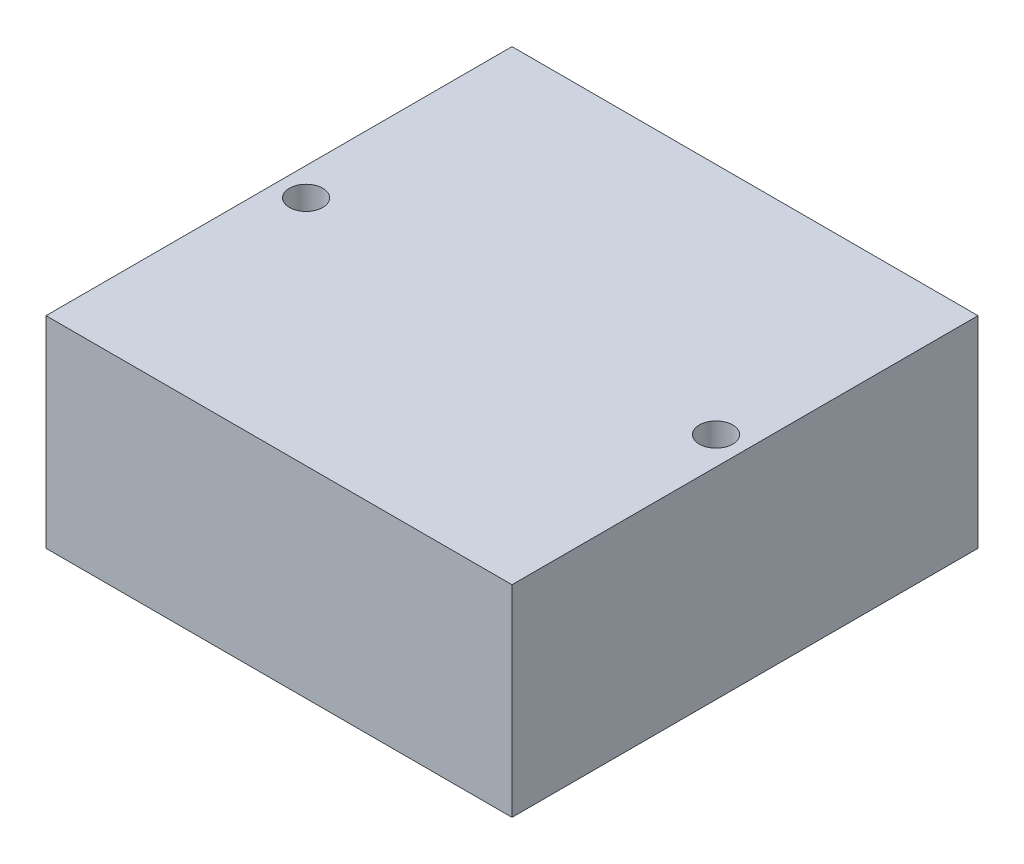
ISO-10303-21;
HEADER;
FILE_DESCRIPTION(('STEP AP214'),'2;1');
FILE_NAME('part.step','',(''),(''),'','','');
FILE_SCHEMA(('AUTOMOTIVE_DESIGN { 1 0 10303 214 1 1 1 1 }'));
ENDSEC;
DATA;
#1=APPLICATION_CONTEXT('core data for automotive mechanical design processes');
#2=APPLICATION_PROTOCOL_DEFINITION('international standard','automotive_design',2000,#1);
#3=PRODUCT_CONTEXT('',#1,'mechanical');
#4=PRODUCT('Part','Part','',(#3));
#5=PRODUCT_RELATED_PRODUCT_CATEGORY('part','',(#4));
#6=PRODUCT_DEFINITION_FORMATION('','',#4);
#7=PRODUCT_DEFINITION_CONTEXT('part definition',#1,'design');
#8=PRODUCT_DEFINITION('design','',#6,#7);
#9=PRODUCT_DEFINITION_SHAPE('','',#8);
#10=(LENGTH_UNIT() NAMED_UNIT(*) SI_UNIT(.MILLI.,.METRE.));
#11=(NAMED_UNIT(*) PLANE_ANGLE_UNIT() SI_UNIT($,.RADIAN.));
#12=(NAMED_UNIT(*) SI_UNIT($,.STERADIAN.) SOLID_ANGLE_UNIT());
#13=UNCERTAINTY_MEASURE_WITH_UNIT(LENGTH_MEASURE(1.E-05),#10,'distance_accuracy_value','');
#14=(GEOMETRIC_REPRESENTATION_CONTEXT(3) GLOBAL_UNCERTAINTY_ASSIGNED_CONTEXT((#13)) GLOBAL_UNIT_ASSIGNED_CONTEXT((#10,
#11,#12)) REPRESENTATION_CONTEXT('',''));
#15=CARTESIAN_POINT('',(0.,0.,0.));
#16=DIRECTION('',(0.,0.,1.));
#17=DIRECTION('',(1.,0.,0.));
#18=AXIS2_PLACEMENT_3D('',#15,#16,#17);
#19=CARTESIAN_POINT('',(0.,32.,0.));
#20=DIRECTION('',(0.,-1.,0.));
#21=DIRECTION('',(0.,0.,-1.));
#22=AXIS2_PLACEMENT_3D('',#19,#20,#21);
#23=PLANE('',#22);
#24=DIRECTION('',(0.,0.,1.));
#25=VECTOR('',#24,1.);
#26=CARTESIAN_POINT('',(0.,32.,0.));
#27=LINE('',#26,#25);
#28=CARTESIAN_POINT('',(0.,32.,-74.));
#29=VERTEX_POINT('',#28);
#30=CARTESIAN_POINT('',(0.,32.,0.));
#31=VERTEX_POINT('',#30);
#32=EDGE_CURVE('E92',#29,#31,#27,.T.);
#33=ORIENTED_EDGE('',*,*,#32,.T.);
#34=DIRECTION('',(1.,0.,0.));
#35=VECTOR('',#34,1.);
#36=CARTESIAN_POINT('',(0.,32.,0.));
#37=LINE('',#36,#35);
#38=CARTESIAN_POINT('',(74.,32.,0.));
#39=VERTEX_POINT('',#38);
#40=EDGE_CURVE('E87',#31,#39,#37,.T.);
#41=ORIENTED_EDGE('',*,*,#40,.T.);
#42=DIRECTION('',(0.,0.,-1.));
#43=VECTOR('',#42,1.);
#44=CARTESIAN_POINT('',(74.,32.,0.));
#45=LINE('',#44,#43);
#46=CARTESIAN_POINT('',(74.,32.,-74.));
#47=VERTEX_POINT('',#46);
#48=EDGE_CURVE('E90',#39,#47,#45,.T.);
#49=ORIENTED_EDGE('',*,*,#48,.T.);
#50=DIRECTION('',(-1.,0.,0.));
#51=VECTOR('',#50,1.);
#52=CARTESIAN_POINT('',(0.,32.,-74.));
#53=LINE('',#52,#51);
#54=EDGE_CURVE('E57',#47,#29,#53,.T.);
#55=ORIENTED_EDGE('',*,*,#54,.T.);
#56=EDGE_LOOP('',(#33,#41,#49,#55));
#57=FACE_BOUND('',#56,.T.);
#58=CARTESIAN_POINT('',(4.45000000000001,32.,-36.85));
#59=DIRECTION('',(0.,1.,0.));
#60=DIRECTION('',(0.,0.,1.));
#61=AXIS2_PLACEMENT_3D('',#58,#59,#60);
#62=CIRCLE('',#61,2.65);
#63=CARTESIAN_POINT('',(4.45000000000001,32.,-34.2));
#64=VERTEX_POINT('',#63);
#65=EDGE_CURVE('E112',#64,#64,#62,.T.);
#66=ORIENTED_EDGE('',*,*,#65,.F.);
#67=EDGE_LOOP('',(#66));
#68=FACE_BOUND('',#67,.T.);
#69=CARTESIAN_POINT('',(69.55,32.,-36.85));
#70=DIRECTION('',(0.,1.,0.));
#71=DIRECTION('',(0.,0.,1.));
#72=AXIS2_PLACEMENT_3D('',#69,#70,#71);
#73=CIRCLE('',#72,2.65);
#74=CARTESIAN_POINT('',(69.55,32.,-34.2));
#75=VERTEX_POINT('',#74);
#76=EDGE_CURVE('E134',#75,#75,#73,.T.);
#77=ORIENTED_EDGE('',*,*,#76,.F.);
#78=EDGE_LOOP('',(#77));
#79=FACE_BOUND('',#78,.T.);
#80=ADVANCED_FACE('F39',(#57,#68,#79),#23,.F.);
#81=CARTESIAN_POINT('',(0.,0.,0.));
#82=DIRECTION('',(0.,-1.,0.));
#83=DIRECTION('',(0.,0.,-1.));
#84=AXIS2_PLACEMENT_3D('',#81,#82,#83);
#85=PLANE('',#84);
#86=CARTESIAN_POINT('',(4.45000000000001,0.,-36.85));
#87=DIRECTION('',(0.,1.,0.));
#88=DIRECTION('',(0.,0.,1.));
#89=AXIS2_PLACEMENT_3D('',#86,#87,#88);
#90=CIRCLE('',#89,2.65);
#91=CARTESIAN_POINT('',(4.45000000000001,0.,-34.2));
#92=VERTEX_POINT('',#91);
#93=EDGE_CURVE('E130',#92,#92,#90,.T.);
#94=ORIENTED_EDGE('',*,*,#93,.T.);
#95=EDGE_LOOP('',(#94));
#96=FACE_BOUND('',#95,.T.);
#97=DIRECTION('',(0.,0.,1.));
#98=VECTOR('',#97,1.);
#99=CARTESIAN_POINT('',(0.,0.,0.));
#100=LINE('',#99,#98);
#101=CARTESIAN_POINT('',(0.,0.,-74.));
#102=VERTEX_POINT('',#101);
#103=CARTESIAN_POINT('',(0.,0.,0.));
#104=VERTEX_POINT('',#103);
#105=EDGE_CURVE('E108',#102,#104,#100,.T.);
#106=ORIENTED_EDGE('',*,*,#105,.F.);
#107=DIRECTION('',(-1.,0.,0.));
#108=VECTOR('',#107,1.);
#109=CARTESIAN_POINT('',(0.,0.,-74.));
#110=LINE('',#109,#108);
#111=CARTESIAN_POINT('',(74.,0.,-74.));
#112=VERTEX_POINT('',#111);
#113=EDGE_CURVE('E80',#112,#102,#110,.T.);
#114=ORIENTED_EDGE('',*,*,#113,.F.);
#115=DIRECTION('',(0.,0.,-1.));
#116=VECTOR('',#115,1.);
#117=CARTESIAN_POINT('',(74.,0.,0.));
#118=LINE('',#117,#116);
#119=CARTESIAN_POINT('',(74.,0.,0.));
#120=VERTEX_POINT('',#119);
#121=EDGE_CURVE('E74',#120,#112,#118,.T.);
#122=ORIENTED_EDGE('',*,*,#121,.F.);
#123=DIRECTION('',(1.,0.,0.));
#124=VECTOR('',#123,1.);
#125=CARTESIAN_POINT('',(0.,0.,0.));
#126=LINE('',#125,#124);
#127=EDGE_CURVE('E97',#104,#120,#126,.T.);
#128=ORIENTED_EDGE('',*,*,#127,.F.);
#129=EDGE_LOOP('',(#106,#114,#122,#128));
#130=FACE_BOUND('',#129,.T.);
#131=CARTESIAN_POINT('',(69.55,0.,-36.85));
#132=DIRECTION('',(0.,1.,0.));
#133=DIRECTION('',(0.,0.,1.));
#134=AXIS2_PLACEMENT_3D('',#131,#132,#133);
#135=CIRCLE('',#134,2.65);
#136=CARTESIAN_POINT('',(69.55,0.,-34.2));
#137=VERTEX_POINT('',#136);
#138=EDGE_CURVE('E138',#137,#137,#135,.T.);
#139=ORIENTED_EDGE('',*,*,#138,.T.);
#140=EDGE_LOOP('',(#139));
#141=FACE_BOUND('',#140,.T.);
#142=ADVANCED_FACE('F125',(#96,#130,#141),#85,.T.);
#143=CARTESIAN_POINT('',(0.,32.,0.));
#144=DIRECTION('',(1.,0.,0.));
#145=DIRECTION('',(0.,0.,-1.));
#146=AXIS2_PLACEMENT_3D('',#143,#144,#145);
#147=PLANE('',#146);
#148=ORIENTED_EDGE('',*,*,#105,.T.);
#149=DIRECTION('',(0.,-1.,0.));
#150=VECTOR('',#149,1.);
#151=CARTESIAN_POINT('',(0.,32.,0.));
#152=LINE('',#151,#150);
#153=EDGE_CURVE('E11',#31,#104,#152,.T.);
#154=ORIENTED_EDGE('',*,*,#153,.F.);
#155=ORIENTED_EDGE('',*,*,#32,.F.);
#156=DIRECTION('',(0.,-1.,0.));
#157=VECTOR('',#156,1.);
#158=CARTESIAN_POINT('',(0.,32.,-74.));
#159=LINE('',#158,#157);
#160=EDGE_CURVE('E104',#29,#102,#159,.T.);
#161=ORIENTED_EDGE('',*,*,#160,.T.);
#162=EDGE_LOOP('',(#148,#154,#155,#161));
#163=FACE_BOUND('',#162,.T.);
#164=ADVANCED_FACE('F41',(#163),#147,.F.);
#165=CARTESIAN_POINT('',(0.,32.,0.));
#166=DIRECTION('',(0.,0.,-1.));
#167=DIRECTION('',(-1.,0.,0.));
#168=AXIS2_PLACEMENT_3D('',#165,#166,#167);
#169=PLANE('',#168);
#170=ORIENTED_EDGE('',*,*,#127,.T.);
#171=DIRECTION('',(0.,-1.,0.));
#172=VECTOR('',#171,1.);
#173=CARTESIAN_POINT('',(74.,32.,0.));
#174=LINE('',#173,#172);
#175=EDGE_CURVE('E49',#39,#120,#174,.T.);
#176=ORIENTED_EDGE('',*,*,#175,.F.);
#177=ORIENTED_EDGE('',*,*,#40,.F.);
#178=ORIENTED_EDGE('',*,*,#153,.T.);
#179=EDGE_LOOP('',(#170,#176,#177,#178));
#180=FACE_BOUND('',#179,.T.);
#181=ADVANCED_FACE('F96',(#180),#169,.F.);
#182=CARTESIAN_POINT('',(74.,32.,0.));
#183=DIRECTION('',(-1.,0.,0.));
#184=DIRECTION('',(0.,0.,1.));
#185=AXIS2_PLACEMENT_3D('',#182,#183,#184);
#186=PLANE('',#185);
#187=ORIENTED_EDGE('',*,*,#121,.T.);
#188=DIRECTION('',(0.,-1.,0.));
#189=VECTOR('',#188,1.);
#190=CARTESIAN_POINT('',(74.,32.,-74.));
#191=LINE('',#190,#189);
#192=EDGE_CURVE('E99',#47,#112,#191,.T.);
#193=ORIENTED_EDGE('',*,*,#192,.F.);
#194=ORIENTED_EDGE('',*,*,#48,.F.);
#195=ORIENTED_EDGE('',*,*,#175,.T.);
#196=EDGE_LOOP('',(#187,#193,#194,#195));
#197=FACE_BOUND('',#196,.T.);
#198=ADVANCED_FACE('F100',(#197),#186,.F.);
#199=CARTESIAN_POINT('',(0.,32.,-74.));
#200=DIRECTION('',(0.,0.,1.));
#201=DIRECTION('',(1.,0.,0.));
#202=AXIS2_PLACEMENT_3D('',#199,#200,#201);
#203=PLANE('',#202);
#204=ORIENTED_EDGE('',*,*,#113,.T.);
#205=ORIENTED_EDGE('',*,*,#160,.F.);
#206=ORIENTED_EDGE('',*,*,#54,.F.);
#207=ORIENTED_EDGE('',*,*,#192,.T.);
#208=EDGE_LOOP('',(#204,#205,#206,#207));
#209=FACE_BOUND('',#208,.T.);
#210=ADVANCED_FACE('F122',(#209),#203,.F.);
#211=CARTESIAN_POINT('',(4.45000000000001,32.,-36.85));
#212=DIRECTION('',(0.,-1.,0.));
#213=DIRECTION('',(0.,0.,-1.));
#214=AXIS2_PLACEMENT_3D('',#211,#212,#213);
#215=CYLINDRICAL_SURFACE('',#214,2.65);
#216=ORIENTED_EDGE('',*,*,#65,.T.);
#217=EDGE_LOOP('',(#216));
#218=FACE_BOUND('',#217,.T.);
#219=ORIENTED_EDGE('',*,*,#93,.F.);
#220=EDGE_LOOP('',(#219));
#221=FACE_BOUND('',#220,.T.);
#222=ADVANCED_FACE('F157',(#218,#221),#215,.F.);
#223=CARTESIAN_POINT('',(69.55,32.,-36.85));
#224=DIRECTION('',(0.,-1.,0.));
#225=DIRECTION('',(0.,0.,-1.));
#226=AXIS2_PLACEMENT_3D('',#223,#224,#225);
#227=CYLINDRICAL_SURFACE('',#226,2.65);
#228=ORIENTED_EDGE('',*,*,#76,.T.);
#229=EDGE_LOOP('',(#228));
#230=FACE_BOUND('',#229,.T.);
#231=ORIENTED_EDGE('',*,*,#138,.F.);
#232=EDGE_LOOP('',(#231));
#233=FACE_BOUND('',#232,.T.);
#234=ADVANCED_FACE('F146',(#230,#233),#227,.F.);
#235=CLOSED_SHELL('',(#80,#142,#164,#181,#198,#210,#222,#234));
#236=MANIFOLD_SOLID_BREP('B2',#235);
#237=ADVANCED_BREP_SHAPE_REPRESENTATION('',(#18,#236),#14);
#238=SHAPE_DEFINITION_REPRESENTATION(#9,#237);
ENDSEC;
END-ISO-10303-21;
